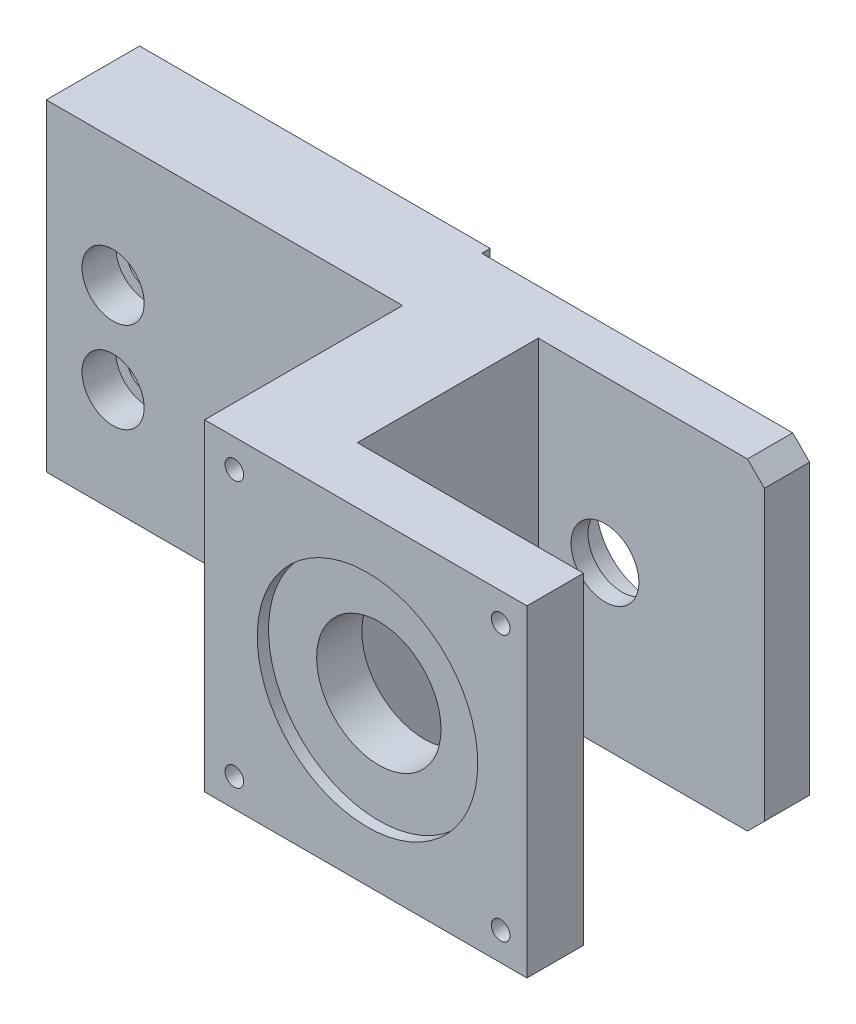
ISO-10303-21;
HEADER;
FILE_DESCRIPTION(('STEP AP214'),'2;1');
FILE_NAME('part.step','',(''),(''),'','','');
FILE_SCHEMA(('AUTOMOTIVE_DESIGN { 1 0 10303 214 1 1 1 1 }'));
ENDSEC;
DATA;
#1=APPLICATION_CONTEXT('core data for automotive mechanical design processes');
#2=APPLICATION_PROTOCOL_DEFINITION('international standard','automotive_design',2000,#1);
#3=PRODUCT_CONTEXT('',#1,'mechanical');
#4=PRODUCT('Part','Part','',(#3));
#5=PRODUCT_RELATED_PRODUCT_CATEGORY('part','',(#4));
#6=PRODUCT_DEFINITION_FORMATION('','',#4);
#7=PRODUCT_DEFINITION_CONTEXT('part definition',#1,'design');
#8=PRODUCT_DEFINITION('design','',#6,#7);
#9=PRODUCT_DEFINITION_SHAPE('','',#8);
#10=(LENGTH_UNIT() NAMED_UNIT(*) SI_UNIT(.MILLI.,.METRE.));
#11=(NAMED_UNIT(*) PLANE_ANGLE_UNIT() SI_UNIT($,.RADIAN.));
#12=(NAMED_UNIT(*) SI_UNIT($,.STERADIAN.) SOLID_ANGLE_UNIT());
#13=UNCERTAINTY_MEASURE_WITH_UNIT(LENGTH_MEASURE(1.E-05),#10,'distance_accuracy_value','');
#14=(GEOMETRIC_REPRESENTATION_CONTEXT(3) GLOBAL_UNCERTAINTY_ASSIGNED_CONTEXT((#13)) GLOBAL_UNIT_ASSIGNED_CONTEXT((#10,
#11,#12)) REPRESENTATION_CONTEXT('',''));
#15=CARTESIAN_POINT('',(0.,0.,0.));
#16=DIRECTION('',(0.,0.,1.));
#17=DIRECTION('',(1.,0.,0.));
#18=AXIS2_PLACEMENT_3D('',#15,#16,#17);
#19=CARTESIAN_POINT('',(91.8,28.5,50.));
#20=DIRECTION('',(0.,0.,-1.));
#21=DIRECTION('',(-1.,0.,0.));
#22=AXIS2_PLACEMENT_3D('',#19,#20,#21);
#23=CYLINDRICAL_SURFACE('',#22,11.);
#24=CARTESIAN_POINT('',(91.8,28.5,40.));
#25=DIRECTION('',(0.,0.,-1.));
#26=DIRECTION('',(-1.,0.,0.));
#27=AXIS2_PLACEMENT_3D('',#24,#25,#26);
#28=CIRCLE('',#27,11.);
#29=CARTESIAN_POINT('',(80.8,28.5,40.));
#30=VERTEX_POINT('',#29);
#31=EDGE_CURVE('E221',#30,#30,#28,.T.);
#32=ORIENTED_EDGE('',*,*,#31,.T.);
#33=EDGE_LOOP('',(#32));
#34=FACE_BOUND('',#33,.T.);
#35=CARTESIAN_POINT('',(91.8,28.5,48.));
#36=DIRECTION('',(0.,0.,1.));
#37=DIRECTION('',(1.,0.,0.));
#38=AXIS2_PLACEMENT_3D('',#35,#36,#37);
#39=CIRCLE('',#38,11.);
#40=CARTESIAN_POINT('',(102.8,28.5,48.));
#41=VERTEX_POINT('',#40);
#42=EDGE_CURVE('E217',#41,#41,#39,.F.);
#43=ORIENTED_EDGE('',*,*,#42,.F.);
#44=EDGE_LOOP('',(#43));
#45=FACE_BOUND('',#44,.T.);
#46=ADVANCED_FACE('F37',(#34,#45),#23,.F.);
#47=CARTESIAN_POINT('',(120.,0.,50.));
#48=DIRECTION('',(-1.,0.,0.));
#49=DIRECTION('',(0.,0.,1.));
#50=AXIS2_PLACEMENT_3D('',#47,#48,#49);
#51=PLANE('',#50);
#52=DIRECTION('',(0.,0.,-1.));
#53=VECTOR('',#52,1.);
#54=CARTESIAN_POINT('',(120.,0.,50.));
#55=LINE('',#54,#53);
#56=CARTESIAN_POINT('',(120.,0.,50.));
#57=VERTEX_POINT('',#56);
#58=CARTESIAN_POINT('',(120.,0.,40.));
#59=VERTEX_POINT('',#58);
#60=EDGE_CURVE('E291',#57,#59,#55,.T.);
#61=ORIENTED_EDGE('',*,*,#60,.T.);
#62=DIRECTION('',(0.,1.,0.));
#63=VECTOR('',#62,1.);
#64=CARTESIAN_POINT('',(120.,0.,40.));
#65=LINE('',#64,#63);
#66=CARTESIAN_POINT('',(120.,57.,40.));
#67=VERTEX_POINT('',#66);
#68=EDGE_CURVE('E320',#59,#67,#65,.T.);
#69=ORIENTED_EDGE('',*,*,#68,.T.);
#70=DIRECTION('',(0.,0.,-1.));
#71=VECTOR('',#70,1.);
#72=CARTESIAN_POINT('',(120.,57.,50.));
#73=LINE('',#72,#71);
#74=CARTESIAN_POINT('',(120.,57.,50.));
#75=VERTEX_POINT('',#74);
#76=EDGE_CURVE('E287',#75,#67,#73,.T.);
#77=ORIENTED_EDGE('',*,*,#76,.F.);
#78=DIRECTION('',(0.,1.,0.));
#79=VECTOR('',#78,1.);
#80=CARTESIAN_POINT('',(120.,0.,50.));
#81=LINE('',#80,#79);
#82=EDGE_CURVE('E455',#57,#75,#81,.T.);
#83=ORIENTED_EDGE('',*,*,#82,.F.);
#84=EDGE_LOOP('',(#61,#69,#77,#83));
#85=FACE_BOUND('',#84,.T.);
#86=ADVANCED_FACE('F360',(#85),#51,.F.);
#87=CARTESIAN_POINT('',(0.,0.,50.));
#88=DIRECTION('',(1.,0.,0.));
#89=DIRECTION('',(0.,0.,-1.));
#90=AXIS2_PLACEMENT_3D('',#87,#88,#89);
#91=PLANE('',#90);
#92=DIRECTION('',(0.,0.,-1.));
#93=VECTOR('',#92,1.);
#94=CARTESIAN_POINT('',(0.,0.,50.));
#95=LINE('',#94,#93);
#96=CARTESIAN_POINT('',(0.,0.,15.));
#97=VERTEX_POINT('',#96);
#98=CARTESIAN_POINT('',(0.,0.,-1.5));
#99=VERTEX_POINT('',#98);
#100=EDGE_CURVE('E272',#97,#99,#95,.T.);
#101=ORIENTED_EDGE('',*,*,#100,.F.);
#102=DIRECTION('',(0.,1.,0.));
#103=VECTOR('',#102,1.);
#104=CARTESIAN_POINT('',(0.,0.,15.));
#105=LINE('',#104,#103);
#106=CARTESIAN_POINT('',(0.,57.,15.));
#107=VERTEX_POINT('',#106);
#108=EDGE_CURVE('E310',#97,#107,#105,.T.);
#109=ORIENTED_EDGE('',*,*,#108,.T.);
#110=DIRECTION('',(0.,0.,-1.));
#111=VECTOR('',#110,1.);
#112=CARTESIAN_POINT('',(0.,57.,50.));
#113=LINE('',#112,#111);
#114=CARTESIAN_POINT('',(0.,57.,-1.5));
#115=VERTEX_POINT('',#114);
#116=EDGE_CURVE('E285',#107,#115,#113,.T.);
#117=ORIENTED_EDGE('',*,*,#116,.T.);
#118=DIRECTION('',(0.,1.,0.));
#119=VECTOR('',#118,1.);
#120=CARTESIAN_POINT('',(0.,57.,-1.5));
#121=LINE('',#120,#119);
#122=EDGE_CURVE('E237',#99,#115,#121,.T.);
#123=ORIENTED_EDGE('',*,*,#122,.F.);
#124=EDGE_LOOP('',(#101,#109,#117,#123));
#125=FACE_BOUND('',#124,.T.);
#126=ADVANCED_FACE('F307',(#125),#91,.F.);
#127=CARTESIAN_POINT('',(0.,0.,50.));
#128=DIRECTION('',(0.,1.,0.));
#129=DIRECTION('',(0.,0.,1.));
#130=AXIS2_PLACEMENT_3D('',#127,#128,#129);
#131=PLANE('',#130);
#132=DIRECTION('',(1.,0.,0.));
#133=VECTOR('',#132,1.);
#134=CARTESIAN_POINT('',(0.,0.,0.));
#135=LINE('',#134,#133);
#136=CARTESIAN_POINT('',(62.,0.,0.));
#137=VERTEX_POINT('',#136);
#138=CARTESIAN_POINT('',(117.,0.,0.));
#139=VERTEX_POINT('',#138);
#140=EDGE_CURVE('E256',#137,#139,#135,.T.);
#141=ORIENTED_EDGE('',*,*,#140,.T.);
#142=DIRECTION('',(0.,0.,1.));
#143=VECTOR('',#142,1.);
#144=CARTESIAN_POINT('',(117.,0.,50.));
#145=LINE('',#144,#143);
#146=CARTESIAN_POINT('',(117.,0.,8.));
#147=VERTEX_POINT('',#146);
#148=EDGE_CURVE('E62',#139,#147,#145,.T.);
#149=ORIENTED_EDGE('',*,*,#148,.T.);
#150=DIRECTION('',(-1.,0.,0.));
#151=VECTOR('',#150,1.);
#152=CARTESIAN_POINT('',(120.,0.,8.));
#153=LINE('',#152,#151);
#154=CARTESIAN_POINT('',(80.,0.,8.00000000000001));
#155=VERTEX_POINT('',#154);
#156=EDGE_CURVE('E477',#147,#155,#153,.T.);
#157=ORIENTED_EDGE('',*,*,#156,.T.);
#158=DIRECTION('',(0.,0.,1.));
#159=VECTOR('',#158,1.);
#160=CARTESIAN_POINT('',(80.,0.,8.00000000000001));
#161=LINE('',#160,#159);
#162=CARTESIAN_POINT('',(80.,0.,40.));
#163=VERTEX_POINT('',#162);
#164=EDGE_CURVE('E450',#155,#163,#161,.T.);
#165=ORIENTED_EDGE('',*,*,#164,.T.);
#166=DIRECTION('',(1.,0.,0.));
#167=VECTOR('',#166,1.);
#168=CARTESIAN_POINT('',(120.,0.,40.));
#169=LINE('',#168,#167);
#170=EDGE_CURVE('E444',#163,#59,#169,.T.);
#171=ORIENTED_EDGE('',*,*,#170,.T.);
#172=ORIENTED_EDGE('',*,*,#60,.F.);
#173=DIRECTION('',(1.,0.,0.));
#174=VECTOR('',#173,1.);
#175=CARTESIAN_POINT('',(0.,0.,50.));
#176=LINE('',#175,#174);
#177=CARTESIAN_POINT('',(63.,0.,50.));
#178=VERTEX_POINT('',#177);
#179=EDGE_CURVE('E279',#178,#57,#176,.T.);
#180=ORIENTED_EDGE('',*,*,#179,.F.);
#181=DIRECTION('',(0.,0.,-1.));
#182=VECTOR('',#181,1.);
#183=CARTESIAN_POINT('',(63.,0.,50.));
#184=LINE('',#183,#182);
#185=CARTESIAN_POINT('',(63.,0.,15.));
#186=VERTEX_POINT('',#185);
#187=EDGE_CURVE('E250',#178,#186,#184,.T.);
#188=ORIENTED_EDGE('',*,*,#187,.T.);
#189=DIRECTION('',(-1.,0.,0.));
#190=VECTOR('',#189,1.);
#191=CARTESIAN_POINT('',(0.,0.,15.));
#192=LINE('',#191,#190);
#193=EDGE_CURVE('E299',#186,#97,#192,.T.);
#194=ORIENTED_EDGE('',*,*,#193,.T.);
#195=ORIENTED_EDGE('',*,*,#100,.T.);
#196=DIRECTION('',(-1.,0.,0.));
#197=VECTOR('',#196,1.);
#198=CARTESIAN_POINT('',(0.,0.,-1.5));
#199=LINE('',#198,#197);
#200=CARTESIAN_POINT('',(62.,0.,-1.5));
#201=VERTEX_POINT('',#200);
#202=EDGE_CURVE('E244',#201,#99,#199,.T.);
#203=ORIENTED_EDGE('',*,*,#202,.F.);
#204=DIRECTION('',(0.,0.,1.));
#205=VECTOR('',#204,1.);
#206=CARTESIAN_POINT('',(62.,0.,-1.5));
#207=LINE('',#206,#205);
#208=EDGE_CURVE('E247',#201,#137,#207,.T.);
#209=ORIENTED_EDGE('',*,*,#208,.T.);
#210=EDGE_LOOP('',(#141,#149,#157,#165,#171,#172,#180,#188,#194,#195,#203,#209));
#211=FACE_BOUND('',#210,.T.);
#212=ADVANCED_FACE('F296',(#211),#131,.F.);
#213=DIRECTION('',(0.,1.,0.));
#214=VECTOR('',#213,1.);
#215=CARTESIAN_POINT('',(120.,0.,8.));
#216=LINE('',#215,#214);
#217=CARTESIAN_POINT('',(120.,3.00000000000001,8.));
#218=VERTEX_POINT('',#217);
#219=CARTESIAN_POINT('',(120.,54.,8.));
#220=VERTEX_POINT('',#219);
#221=EDGE_CURVE('E442',#218,#220,#216,.T.);
#222=ORIENTED_EDGE('',*,*,#221,.F.);
#223=DIRECTION('',(0.,0.,-1.));
#224=VECTOR('',#223,1.);
#225=CARTESIAN_POINT('',(120.,3.00000000000002,50.));
#226=LINE('',#225,#224);
#227=CARTESIAN_POINT('',(120.,3.00000000000004,0.));
#228=VERTEX_POINT('',#227);
#229=EDGE_CURVE('E271',#218,#228,#226,.T.);
#230=ORIENTED_EDGE('',*,*,#229,.T.);
#231=DIRECTION('',(0.,1.,0.));
#232=VECTOR('',#231,1.);
#233=CARTESIAN_POINT('',(120.,0.,0.));
#234=LINE('',#233,#232);
#235=CARTESIAN_POINT('',(120.,54.,0.));
#236=VERTEX_POINT('',#235);
#237=EDGE_CURVE('E280',#228,#236,#234,.T.);
#238=ORIENTED_EDGE('',*,*,#237,.T.);
#239=DIRECTION('',(0.,0.,1.));
#240=VECTOR('',#239,1.);
#241=CARTESIAN_POINT('',(120.,54.,50.));
#242=LINE('',#241,#240);
#243=EDGE_CURVE('E269',#236,#220,#242,.T.);
#244=ORIENTED_EDGE('',*,*,#243,.T.);
#245=EDGE_LOOP('',(#222,#230,#238,#244));
#246=FACE_BOUND('',#245,.T.);
#247=ADVANCED_FACE('F368',(#246),#51,.F.);
#248=CARTESIAN_POINT('',(0.,57.,50.));
#249=DIRECTION('',(0.,-1.,0.));
#250=DIRECTION('',(0.,0.,-1.));
#251=AXIS2_PLACEMENT_3D('',#248,#249,#250);
#252=PLANE('',#251);
#253=DIRECTION('',(-1.,0.,0.));
#254=VECTOR('',#253,1.);
#255=CARTESIAN_POINT('',(120.,57.,8.));
#256=LINE('',#255,#254);
#257=CARTESIAN_POINT('',(117.,57.,8.));
#258=VERTEX_POINT('',#257);
#259=CARTESIAN_POINT('',(80.,57.,8.00000000000001));
#260=VERTEX_POINT('',#259);
#261=EDGE_CURVE('E438',#258,#260,#256,.T.);
#262=ORIENTED_EDGE('',*,*,#261,.F.);
#263=DIRECTION('',(0.,0.,-1.));
#264=VECTOR('',#263,1.);
#265=CARTESIAN_POINT('',(117.,57.,50.));
#266=LINE('',#265,#264);
#267=CARTESIAN_POINT('',(117.,57.,0.));
#268=VERTEX_POINT('',#267);
#269=EDGE_CURVE('E11',#258,#268,#266,.T.);
#270=ORIENTED_EDGE('',*,*,#269,.T.);
#271=DIRECTION('',(-1.,0.,0.));
#272=VECTOR('',#271,1.);
#273=CARTESIAN_POINT('',(0.,57.,0.));
#274=LINE('',#273,#272);
#275=CARTESIAN_POINT('',(62.,57.,0.));
#276=VERTEX_POINT('',#275);
#277=EDGE_CURVE('E276',#268,#276,#274,.T.);
#278=ORIENTED_EDGE('',*,*,#277,.T.);
#279=DIRECTION('',(0.,0.,1.));
#280=VECTOR('',#279,1.);
#281=CARTESIAN_POINT('',(62.,57.,-1.5));
#282=LINE('',#281,#280);
#283=CARTESIAN_POINT('',(62.,57.,-1.5));
#284=VERTEX_POINT('',#283);
#285=EDGE_CURVE('E261',#284,#276,#282,.T.);
#286=ORIENTED_EDGE('',*,*,#285,.F.);
#287=DIRECTION('',(1.,0.,0.));
#288=VECTOR('',#287,1.);
#289=CARTESIAN_POINT('',(0.,57.,-1.5));
#290=LINE('',#289,#288);
#291=EDGE_CURVE('E240',#115,#284,#290,.T.);
#292=ORIENTED_EDGE('',*,*,#291,.F.);
#293=ORIENTED_EDGE('',*,*,#116,.F.);
#294=DIRECTION('',(-1.,0.,0.));
#295=VECTOR('',#294,1.);
#296=CARTESIAN_POINT('',(0.,57.,15.));
#297=LINE('',#296,#295);
#298=CARTESIAN_POINT('',(63.,57.,15.));
#299=VERTEX_POINT('',#298);
#300=EDGE_CURVE('E469',#299,#107,#297,.T.);
#301=ORIENTED_EDGE('',*,*,#300,.F.);
#302=DIRECTION('',(0.,0.,-1.));
#303=VECTOR('',#302,1.);
#304=CARTESIAN_POINT('',(63.,57.,50.));
#305=LINE('',#304,#303);
#306=CARTESIAN_POINT('',(63.,57.,50.));
#307=VERTEX_POINT('',#306);
#308=EDGE_CURVE('E266',#307,#299,#305,.T.);
#309=ORIENTED_EDGE('',*,*,#308,.F.);
#310=DIRECTION('',(-1.,0.,0.));
#311=VECTOR('',#310,1.);
#312=CARTESIAN_POINT('',(0.,57.,50.));
#313=LINE('',#312,#311);
#314=EDGE_CURVE('E288',#75,#307,#313,.T.);
#315=ORIENTED_EDGE('',*,*,#314,.F.);
#316=ORIENTED_EDGE('',*,*,#76,.T.);
#317=DIRECTION('',(1.,0.,0.));
#318=VECTOR('',#317,1.);
#319=CARTESIAN_POINT('',(120.,57.,40.));
#320=LINE('',#319,#318);
#321=CARTESIAN_POINT('',(80.,57.,40.));
#322=VERTEX_POINT('',#321);
#323=EDGE_CURVE('E479',#322,#67,#320,.T.);
#324=ORIENTED_EDGE('',*,*,#323,.F.);
#325=DIRECTION('',(0.,0.,1.));
#326=VECTOR('',#325,1.);
#327=CARTESIAN_POINT('',(80.,57.,8.00000000000001));
#328=LINE('',#327,#326);
#329=EDGE_CURVE('E483',#260,#322,#328,.T.);
#330=ORIENTED_EDGE('',*,*,#329,.F.);
#331=EDGE_LOOP('',(#262,#270,#278,#286,#292,#293,#301,#309,#315,#316,#324,#330));
#332=FACE_BOUND('',#331,.T.);
#333=ADVANCED_FACE('F314',(#332),#252,.F.);
#334=CARTESIAN_POINT('',(0.,57.,50.));
#335=DIRECTION('',(0.,0.,-1.));
#336=DIRECTION('',(-1.,0.,0.));
#337=AXIS2_PLACEMENT_3D('',#334,#335,#336);
#338=PLANE('',#337);
#339=CARTESIAN_POINT('',(68.25,52.,50.));
#340=DIRECTION('',(0.,0.,1.));
#341=DIRECTION('',(1.,0.,0.));
#342=AXIS2_PLACEMENT_3D('',#339,#340,#341);
#343=CIRCLE('',#342,1.65);
#344=CARTESIAN_POINT('',(69.9,52.,50.));
#345=VERTEX_POINT('',#344);
#346=EDGE_CURVE('E157',#345,#345,#343,.T.);
#347=ORIENTED_EDGE('',*,*,#346,.F.);
#348=EDGE_LOOP('',(#347));
#349=FACE_BOUND('',#348,.T.);
#350=CARTESIAN_POINT('',(115.35,5.00000000000001,50.));
#351=DIRECTION('',(0.,0.,1.));
#352=DIRECTION('',(1.,0.,0.));
#353=AXIS2_PLACEMENT_3D('',#350,#351,#352);
#354=CIRCLE('',#353,1.65);
#355=CARTESIAN_POINT('',(117.,5.00000000000001,50.));
#356=VERTEX_POINT('',#355);
#357=EDGE_CURVE('E156',#356,#356,#354,.T.);
#358=ORIENTED_EDGE('',*,*,#357,.F.);
#359=EDGE_LOOP('',(#358));
#360=FACE_BOUND('',#359,.T.);
#361=CARTESIAN_POINT('',(115.35,52.,50.));
#362=DIRECTION('',(0.,0.,1.));
#363=DIRECTION('',(1.,0.,0.));
#364=AXIS2_PLACEMENT_3D('',#361,#362,#363);
#365=CIRCLE('',#364,1.65);
#366=CARTESIAN_POINT('',(117.,52.,50.));
#367=VERTEX_POINT('',#366);
#368=EDGE_CURVE('E164',#367,#367,#365,.T.);
#369=ORIENTED_EDGE('',*,*,#368,.F.);
#370=EDGE_LOOP('',(#369));
#371=FACE_BOUND('',#370,.T.);
#372=CARTESIAN_POINT('',(68.25,5.,50.));
#373=DIRECTION('',(0.,0.,1.));
#374=DIRECTION('',(1.,0.,0.));
#375=AXIS2_PLACEMENT_3D('',#372,#373,#374);
#376=CIRCLE('',#375,1.65);
#377=CARTESIAN_POINT('',(69.9,5.,50.));
#378=VERTEX_POINT('',#377);
#379=EDGE_CURVE('E168',#378,#378,#376,.T.);
#380=ORIENTED_EDGE('',*,*,#379,.F.);
#381=EDGE_LOOP('',(#380));
#382=FACE_BOUND('',#381,.T.);
#383=CARTESIAN_POINT('',(91.8,28.5,50.));
#384=DIRECTION('',(0.,0.,1.));
#385=DIRECTION('',(1.,0.,0.));
#386=AXIS2_PLACEMENT_3D('',#383,#384,#385);
#387=CIRCLE('',#386,19.5);
#388=CARTESIAN_POINT('',(111.3,28.5,50.));
#389=VERTEX_POINT('',#388);
#390=EDGE_CURVE('E218',#389,#389,#387,.T.);
#391=ORIENTED_EDGE('',*,*,#390,.F.);
#392=EDGE_LOOP('',(#391));
#393=FACE_BOUND('',#392,.T.);
#394=ORIENTED_EDGE('',*,*,#314,.T.);
#395=DIRECTION('',(0.,1.,0.));
#396=VECTOR('',#395,1.);
#397=CARTESIAN_POINT('',(63.,0.,50.));
#398=LINE('',#397,#396);
#399=EDGE_CURVE('E462',#178,#307,#398,.T.);
#400=ORIENTED_EDGE('',*,*,#399,.F.);
#401=ORIENTED_EDGE('',*,*,#179,.T.);
#402=ORIENTED_EDGE('',*,*,#82,.T.);
#403=EDGE_LOOP('',(#394,#400,#401,#402));
#404=FACE_BOUND('',#403,.T.);
#405=ADVANCED_FACE('F411',(#349,#360,#371,#382,#393,#404),#338,.F.);
#406=CARTESIAN_POINT('',(0.,57.,0.));
#407=DIRECTION('',(0.,0.,-1.));
#408=DIRECTION('',(-1.,0.,0.));
#409=AXIS2_PLACEMENT_3D('',#406,#407,#408);
#410=PLANE('',#409);
#411=CARTESIAN_POINT('',(91.8,28.5,0.));
#412=DIRECTION('',(0.,0.,-1.));
#413=DIRECTION('',(-1.,0.,0.));
#414=AXIS2_PLACEMENT_3D('',#411,#412,#413);
#415=CIRCLE('',#414,9.49999999999999);
#416=CARTESIAN_POINT('',(82.3,28.5,0.));
#417=VERTEX_POINT('',#416);
#418=EDGE_CURVE('E230',#417,#417,#415,.T.);
#419=ORIENTED_EDGE('',*,*,#418,.F.);
#420=EDGE_LOOP('',(#419));
#421=FACE_BOUND('',#420,.T.);
#422=ORIENTED_EDGE('',*,*,#237,.F.);
#423=DIRECTION('',(0.707106781186551,0.707106781186544,0.));
#424=VECTOR('',#423,1.);
#425=CARTESIAN_POINT('',(86.9999999999994,-30.0000000000002,0.));
#426=LINE('',#425,#424);
#427=EDGE_CURVE('E325',#228,#139,#426,.F.);
#428=ORIENTED_EDGE('',*,*,#427,.T.);
#429=ORIENTED_EDGE('',*,*,#140,.F.);
#430=DIRECTION('',(0.,-1.,0.));
#431=VECTOR('',#430,1.);
#432=CARTESIAN_POINT('',(62.,57.,0.));
#433=LINE('',#432,#431);
#434=EDGE_CURVE('E234',#276,#137,#433,.T.);
#435=ORIENTED_EDGE('',*,*,#434,.F.);
#436=ORIENTED_EDGE('',*,*,#277,.F.);
#437=DIRECTION('',(-0.707106781186546,0.707106781186549,0.));
#438=VECTOR('',#437,1.);
#439=CARTESIAN_POINT('',(58.5000000000003,115.5,0.));
#440=LINE('',#439,#438);
#441=EDGE_CURVE('E275',#268,#236,#440,.F.);
#442=ORIENTED_EDGE('',*,*,#441,.T.);
#443=EDGE_LOOP('',(#422,#428,#429,#435,#436,#442));
#444=FACE_BOUND('',#443,.T.);
#445=ADVANCED_FACE('F403',(#421,#444),#410,.T.);
#446=CARTESIAN_POINT('',(120.,0.,40.));
#447=DIRECTION('',(0.,0.,1.));
#448=DIRECTION('',(1.,0.,0.));
#449=AXIS2_PLACEMENT_3D('',#446,#447,#448);
#450=PLANE('',#449);
#451=CARTESIAN_POINT('',(115.35,5.00000000000001,40.));
#452=DIRECTION('',(0.,0.,1.));
#453=DIRECTION('',(1.,0.,0.));
#454=AXIS2_PLACEMENT_3D('',#451,#452,#453);
#455=CIRCLE('',#454,1.65);
#456=CARTESIAN_POINT('',(117.,5.00000000000001,40.));
#457=VERTEX_POINT('',#456);
#458=EDGE_CURVE('E41',#457,#457,#455,.T.);
#459=ORIENTED_EDGE('',*,*,#458,.T.);
#460=EDGE_LOOP('',(#459));
#461=FACE_BOUND('',#460,.T.);
#462=CARTESIAN_POINT('',(115.35,52.,40.));
#463=DIRECTION('',(0.,0.,1.));
#464=DIRECTION('',(1.,0.,0.));
#465=AXIS2_PLACEMENT_3D('',#462,#463,#464);
#466=CIRCLE('',#465,1.65);
#467=CARTESIAN_POINT('',(117.,52.,40.));
#468=VERTEX_POINT('',#467);
#469=EDGE_CURVE('E167',#468,#468,#466,.T.);
#470=ORIENTED_EDGE('',*,*,#469,.T.);
#471=EDGE_LOOP('',(#470));
#472=FACE_BOUND('',#471,.T.);
#473=ORIENTED_EDGE('',*,*,#31,.F.);
#474=EDGE_LOOP('',(#473));
#475=FACE_BOUND('',#474,.T.);
#476=ORIENTED_EDGE('',*,*,#323,.T.);
#477=ORIENTED_EDGE('',*,*,#68,.F.);
#478=ORIENTED_EDGE('',*,*,#170,.F.);
#479=DIRECTION('',(0.,1.,0.));
#480=VECTOR('',#479,1.);
#481=CARTESIAN_POINT('',(80.,0.,40.));
#482=LINE('',#481,#480);
#483=EDGE_CURVE('E447',#163,#322,#482,.T.);
#484=ORIENTED_EDGE('',*,*,#483,.T.);
#485=EDGE_LOOP('',(#476,#477,#478,#484));
#486=FACE_BOUND('',#485,.T.);
#487=ADVANCED_FACE('F342',(#461,#472,#475,#486),#450,.F.);
#488=CARTESIAN_POINT('',(80.,0.,8.00000000000001));
#489=DIRECTION('',(-1.,0.,0.));
#490=DIRECTION('',(0.,0.,1.));
#491=AXIS2_PLACEMENT_3D('',#488,#489,#490);
#492=PLANE('',#491);
#493=ORIENTED_EDGE('',*,*,#329,.T.);
#494=ORIENTED_EDGE('',*,*,#483,.F.);
#495=ORIENTED_EDGE('',*,*,#164,.F.);
#496=DIRECTION('',(0.,1.,0.));
#497=VECTOR('',#496,1.);
#498=CARTESIAN_POINT('',(80.,0.,8.00000000000001));
#499=LINE('',#498,#497);
#500=EDGE_CURVE('E443',#155,#260,#499,.T.);
#501=ORIENTED_EDGE('',*,*,#500,.T.);
#502=EDGE_LOOP('',(#493,#494,#495,#501));
#503=FACE_BOUND('',#502,.T.);
#504=ADVANCED_FACE('F402',(#503),#492,.F.);
#505=CARTESIAN_POINT('',(120.,0.,8.));
#506=DIRECTION('',(0.,0.,-1.));
#507=DIRECTION('',(-1.,0.,0.));
#508=AXIS2_PLACEMENT_3D('',#505,#506,#507);
#509=PLANE('',#508);
#510=CARTESIAN_POINT('',(91.8,28.5,8.));
#511=DIRECTION('',(0.,0.,-1.));
#512=DIRECTION('',(-1.,0.,0.));
#513=AXIS2_PLACEMENT_3D('',#510,#511,#512);
#514=CIRCLE('',#513,6.);
#515=CARTESIAN_POINT('',(85.8,28.5,8.));
#516=VERTEX_POINT('',#515);
#517=EDGE_CURVE('E227',#516,#516,#514,.T.);
#518=ORIENTED_EDGE('',*,*,#517,.T.);
#519=EDGE_LOOP('',(#518));
#520=FACE_BOUND('',#519,.T.);
#521=ORIENTED_EDGE('',*,*,#156,.F.);
#522=DIRECTION('',(-0.707106781186551,-0.707106781186544,0.));
#523=VECTOR('',#522,1.);
#524=CARTESIAN_POINT('',(120.,3.00000000000001,8.));
#525=LINE('',#524,#523);
#526=EDGE_CURVE('E46',#147,#218,#525,.F.);
#527=ORIENTED_EDGE('',*,*,#526,.T.);
#528=ORIENTED_EDGE('',*,*,#221,.T.);
#529=DIRECTION('',(0.707106781186546,-0.707106781186549,0.));
#530=VECTOR('',#529,1.);
#531=CARTESIAN_POINT('',(117.,57.,8.));
#532=LINE('',#531,#530);
#533=EDGE_CURVE('E54',#220,#258,#532,.F.);
#534=ORIENTED_EDGE('',*,*,#533,.T.);
#535=ORIENTED_EDGE('',*,*,#261,.T.);
#536=ORIENTED_EDGE('',*,*,#500,.F.);
#537=EDGE_LOOP('',(#521,#527,#528,#534,#535,#536));
#538=FACE_BOUND('',#537,.T.);
#539=ADVANCED_FACE('F395',(#520,#538),#509,.F.);
#540=CARTESIAN_POINT('',(0.,0.,15.));
#541=DIRECTION('',(0.,0.,-1.));
#542=DIRECTION('',(-1.,0.,0.));
#543=AXIS2_PLACEMENT_3D('',#540,#541,#542);
#544=PLANE('',#543);
#545=CARTESIAN_POINT('',(11.8,34.4999999999999,15.));
#546=DIRECTION('',(0.,0.,1.));
#547=DIRECTION('',(1.,0.,0.));
#548=AXIS2_PLACEMENT_3D('',#545,#546,#547);
#549=CIRCLE('',#548,5.5);
#550=CARTESIAN_POINT('',(17.3,34.4999999999999,15.));
#551=VERTEX_POINT('',#550);
#552=EDGE_CURVE('E174',#551,#551,#549,.T.);
#553=ORIENTED_EDGE('',*,*,#552,.F.);
#554=EDGE_LOOP('',(#553));
#555=FACE_BOUND('',#554,.T.);
#556=CARTESIAN_POINT('',(11.8,18.4999999999999,15.));
#557=DIRECTION('',(0.,0.,1.));
#558=DIRECTION('',(1.,0.,0.));
#559=AXIS2_PLACEMENT_3D('',#556,#557,#558);
#560=CIRCLE('',#559,5.5);
#561=CARTESIAN_POINT('',(17.3,18.4999999999999,15.));
#562=VERTEX_POINT('',#561);
#563=EDGE_CURVE('E184',#562,#562,#560,.T.);
#564=ORIENTED_EDGE('',*,*,#563,.F.);
#565=EDGE_LOOP('',(#564));
#566=FACE_BOUND('',#565,.T.);
#567=CARTESIAN_POINT('',(51.8,18.4999999999999,15.));
#568=DIRECTION('',(0.,0.,1.));
#569=DIRECTION('',(1.,0.,0.));
#570=AXIS2_PLACEMENT_3D('',#567,#568,#569);
#571=CIRCLE('',#570,5.5);
#572=CARTESIAN_POINT('',(57.3,18.4999999999999,15.));
#573=VERTEX_POINT('',#572);
#574=EDGE_CURVE('E194',#573,#573,#571,.T.);
#575=ORIENTED_EDGE('',*,*,#574,.F.);
#576=EDGE_LOOP('',(#575));
#577=FACE_BOUND('',#576,.T.);
#578=CARTESIAN_POINT('',(51.8,34.4999999999999,15.));
#579=DIRECTION('',(0.,0.,1.));
#580=DIRECTION('',(1.,0.,0.));
#581=AXIS2_PLACEMENT_3D('',#578,#579,#580);
#582=CIRCLE('',#581,5.5);
#583=CARTESIAN_POINT('',(57.3,34.4999999999999,15.));
#584=VERTEX_POINT('',#583);
#585=EDGE_CURVE('E204',#584,#584,#582,.T.);
#586=ORIENTED_EDGE('',*,*,#585,.F.);
#587=EDGE_LOOP('',(#586));
#588=FACE_BOUND('',#587,.T.);
#589=ORIENTED_EDGE('',*,*,#300,.T.);
#590=ORIENTED_EDGE('',*,*,#108,.F.);
#591=ORIENTED_EDGE('',*,*,#193,.F.);
#592=DIRECTION('',(0.,1.,0.));
#593=VECTOR('',#592,1.);
#594=CARTESIAN_POINT('',(63.,0.,15.));
#595=LINE('',#594,#593);
#596=EDGE_CURVE('E474',#186,#299,#595,.T.);
#597=ORIENTED_EDGE('',*,*,#596,.T.);
#598=EDGE_LOOP('',(#589,#590,#591,#597));
#599=FACE_BOUND('',#598,.T.);
#600=ADVANCED_FACE('F392',(#555,#566,#577,#588,#599),#544,.F.);
#601=CARTESIAN_POINT('',(63.,0.,50.));
#602=DIRECTION('',(1.,0.,0.));
#603=DIRECTION('',(0.,0.,-1.));
#604=AXIS2_PLACEMENT_3D('',#601,#602,#603);
#605=PLANE('',#604);
#606=ORIENTED_EDGE('',*,*,#308,.T.);
#607=ORIENTED_EDGE('',*,*,#596,.F.);
#608=ORIENTED_EDGE('',*,*,#187,.F.);
#609=ORIENTED_EDGE('',*,*,#399,.T.);
#610=EDGE_LOOP('',(#606,#607,#608,#609));
#611=FACE_BOUND('',#610,.T.);
#612=ADVANCED_FACE('F391',(#611),#605,.F.);
#613=CARTESIAN_POINT('',(62.,57.,-1.5));
#614=DIRECTION('',(-1.,0.,0.));
#615=DIRECTION('',(0.,-1.,0.));
#616=AXIS2_PLACEMENT_3D('',#613,#614,#615);
#617=PLANE('',#616);
#618=ORIENTED_EDGE('',*,*,#434,.T.);
#619=ORIENTED_EDGE('',*,*,#208,.F.);
#620=DIRECTION('',(0.,-1.,0.));
#621=VECTOR('',#620,1.);
#622=CARTESIAN_POINT('',(62.,57.,-1.5));
#623=LINE('',#622,#621);
#624=EDGE_CURVE('E242',#284,#201,#623,.T.);
#625=ORIENTED_EDGE('',*,*,#624,.F.);
#626=ORIENTED_EDGE('',*,*,#285,.T.);
#627=EDGE_LOOP('',(#618,#619,#625,#626));
#628=FACE_BOUND('',#627,.T.);
#629=ADVANCED_FACE('F318',(#628),#617,.F.);
#630=CARTESIAN_POINT('',(0.,0.,-1.5));
#631=DIRECTION('',(0.,0.,1.));
#632=DIRECTION('',(1.,0.,0.));
#633=AXIS2_PLACEMENT_3D('',#630,#631,#632);
#634=PLANE('',#633);
#635=CARTESIAN_POINT('',(11.8,34.4999999999999,-1.5));
#636=DIRECTION('',(0.,0.,1.));
#637=DIRECTION('',(1.,0.,0.));
#638=AXIS2_PLACEMENT_3D('',#635,#636,#637);
#639=CIRCLE('',#638,3.5);
#640=CARTESIAN_POINT('',(15.3,34.4999999999999,-1.5));
#641=VERTEX_POINT('',#640);
#642=EDGE_CURVE('E183',#641,#641,#639,.T.);
#643=ORIENTED_EDGE('',*,*,#642,.T.);
#644=EDGE_LOOP('',(#643));
#645=FACE_BOUND('',#644,.T.);
#646=CARTESIAN_POINT('',(11.8,18.4999999999999,-1.5));
#647=DIRECTION('',(0.,0.,1.));
#648=DIRECTION('',(1.,0.,0.));
#649=AXIS2_PLACEMENT_3D('',#646,#647,#648);
#650=CIRCLE('',#649,3.5);
#651=CARTESIAN_POINT('',(15.3,18.4999999999999,-1.5));
#652=VERTEX_POINT('',#651);
#653=EDGE_CURVE('E193',#652,#652,#650,.T.);
#654=ORIENTED_EDGE('',*,*,#653,.T.);
#655=EDGE_LOOP('',(#654));
#656=FACE_BOUND('',#655,.T.);
#657=CARTESIAN_POINT('',(51.8,18.4999999999999,-1.5));
#658=DIRECTION('',(0.,0.,1.));
#659=DIRECTION('',(1.,0.,0.));
#660=AXIS2_PLACEMENT_3D('',#657,#658,#659);
#661=CIRCLE('',#660,3.5);
#662=CARTESIAN_POINT('',(55.3,18.4999999999999,-1.5));
#663=VERTEX_POINT('',#662);
#664=EDGE_CURVE('E203',#663,#663,#661,.T.);
#665=ORIENTED_EDGE('',*,*,#664,.T.);
#666=EDGE_LOOP('',(#665));
#667=FACE_BOUND('',#666,.T.);
#668=CARTESIAN_POINT('',(51.8,34.4999999999999,-1.5));
#669=DIRECTION('',(0.,0.,1.));
#670=DIRECTION('',(1.,0.,0.));
#671=AXIS2_PLACEMENT_3D('',#668,#669,#670);
#672=CIRCLE('',#671,3.5);
#673=CARTESIAN_POINT('',(55.3,34.4999999999999,-1.5));
#674=VERTEX_POINT('',#673);
#675=EDGE_CURVE('E213',#674,#674,#672,.T.);
#676=ORIENTED_EDGE('',*,*,#675,.T.);
#677=EDGE_LOOP('',(#676));
#678=FACE_BOUND('',#677,.T.);
#679=ORIENTED_EDGE('',*,*,#122,.T.);
#680=ORIENTED_EDGE('',*,*,#291,.T.);
#681=ORIENTED_EDGE('',*,*,#624,.T.);
#682=ORIENTED_EDGE('',*,*,#202,.T.);
#683=EDGE_LOOP('',(#679,#680,#681,#682));
#684=FACE_BOUND('',#683,.T.);
#685=ADVANCED_FACE('F304',(#645,#656,#667,#678,#684),#634,.F.);
#686=CARTESIAN_POINT('',(91.8,28.5,5.));
#687=DIRECTION('',(0.,0.,-1.));
#688=DIRECTION('',(-1.,0.,0.));
#689=AXIS2_PLACEMENT_3D('',#686,#687,#688);
#690=CYLINDRICAL_SURFACE('',#689,9.49999999999999);
#691=CARTESIAN_POINT('',(91.8,28.5,5.));
#692=DIRECTION('',(0.,0.,-1.));
#693=DIRECTION('',(-1.,0.,0.));
#694=AXIS2_PLACEMENT_3D('',#691,#692,#693);
#695=CIRCLE('',#694,9.49999999999999);
#696=CARTESIAN_POINT('',(82.3,28.5,5.));
#697=VERTEX_POINT('',#696);
#698=EDGE_CURVE('E231',#697,#697,#695,.T.);
#699=ORIENTED_EDGE('',*,*,#698,.F.);
#700=EDGE_LOOP('',(#699));
#701=FACE_BOUND('',#700,.T.);
#702=ORIENTED_EDGE('',*,*,#418,.T.);
#703=EDGE_LOOP('',(#702));
#704=FACE_BOUND('',#703,.T.);
#705=ADVANCED_FACE('F381',(#701,#704),#690,.F.);
#706=CARTESIAN_POINT('',(91.8,28.5,5.));
#707=DIRECTION('',(0.,0.,-1.));
#708=DIRECTION('',(-1.,0.,0.));
#709=AXIS2_PLACEMENT_3D('',#706,#707,#708);
#710=PLANE('',#709);
#711=CARTESIAN_POINT('',(91.8,28.5,5.));
#712=DIRECTION('',(0.,0.,-1.));
#713=DIRECTION('',(-1.,0.,0.));
#714=AXIS2_PLACEMENT_3D('',#711,#712,#713);
#715=CIRCLE('',#714,6.);
#716=CARTESIAN_POINT('',(85.8,28.5,5.));
#717=VERTEX_POINT('',#716);
#718=EDGE_CURVE('E224',#717,#717,#715,.T.);
#719=ORIENTED_EDGE('',*,*,#718,.F.);
#720=EDGE_LOOP('',(#719));
#721=FACE_BOUND('',#720,.T.);
#722=ORIENTED_EDGE('',*,*,#698,.T.);
#723=EDGE_LOOP('',(#722));
#724=FACE_BOUND('',#723,.T.);
#725=ADVANCED_FACE('F377',(#721,#724),#710,.T.);
#726=CARTESIAN_POINT('',(91.8,28.5,25.));
#727=DIRECTION('',(0.,0.,-1.));
#728=DIRECTION('',(-1.,0.,0.));
#729=AXIS2_PLACEMENT_3D('',#726,#727,#728);
#730=CYLINDRICAL_SURFACE('',#729,6.);
#731=ORIENTED_EDGE('',*,*,#718,.T.);
#732=EDGE_LOOP('',(#731));
#733=FACE_BOUND('',#732,.T.);
#734=ORIENTED_EDGE('',*,*,#517,.F.);
#735=EDGE_LOOP('',(#734));
#736=FACE_BOUND('',#735,.T.);
#737=ADVANCED_FACE('F374',(#733,#736),#730,.F.);
#738=CARTESIAN_POINT('',(120.,3.00000000000002,50.));
#739=DIRECTION('',(-0.707106781186544,0.707106781186551,0.));
#740=DIRECTION('',(-0.707106781186551,-0.707106781186544,0.));
#741=AXIS2_PLACEMENT_3D('',#738,#739,#740);
#742=PLANE('',#741);
#743=ORIENTED_EDGE('',*,*,#526,.F.);
#744=ORIENTED_EDGE('',*,*,#148,.F.);
#745=ORIENTED_EDGE('',*,*,#427,.F.);
#746=ORIENTED_EDGE('',*,*,#229,.F.);
#747=EDGE_LOOP('',(#743,#744,#745,#746));
#748=FACE_BOUND('',#747,.T.);
#749=ADVANCED_FACE('F323',(#748),#742,.F.);
#750=CARTESIAN_POINT('',(117.,57.,50.));
#751=DIRECTION('',(-0.707106781186549,-0.707106781186546,0.));
#752=DIRECTION('',(0.707106781186546,-0.707106781186549,0.));
#753=AXIS2_PLACEMENT_3D('',#750,#751,#752);
#754=PLANE('',#753);
#755=ORIENTED_EDGE('',*,*,#533,.F.);
#756=ORIENTED_EDGE('',*,*,#243,.F.);
#757=ORIENTED_EDGE('',*,*,#441,.F.);
#758=ORIENTED_EDGE('',*,*,#269,.F.);
#759=EDGE_LOOP('',(#755,#756,#757,#758));
#760=FACE_BOUND('',#759,.T.);
#761=ADVANCED_FACE('F39',(#760),#754,.F.);
#762=CARTESIAN_POINT('',(91.8,28.5,48.));
#763=DIRECTION('',(0.,0.,1.));
#764=DIRECTION('',(1.,0.,0.));
#765=AXIS2_PLACEMENT_3D('',#762,#763,#764);
#766=PLANE('',#765);
#767=CARTESIAN_POINT('',(91.8,28.5,48.));
#768=DIRECTION('',(0.,0.,1.));
#769=DIRECTION('',(1.,0.,0.));
#770=AXIS2_PLACEMENT_3D('',#767,#768,#769);
#771=CIRCLE('',#770,19.5);
#772=CARTESIAN_POINT('',(111.3,28.5,48.));
#773=VERTEX_POINT('',#772);
#774=EDGE_CURVE('E214',#773,#773,#771,.T.);
#775=ORIENTED_EDGE('',*,*,#774,.T.);
#776=EDGE_LOOP('',(#775));
#777=FACE_BOUND('',#776,.T.);
#778=ORIENTED_EDGE('',*,*,#42,.T.);
#779=EDGE_LOOP('',(#778));
#780=FACE_BOUND('',#779,.T.);
#781=ADVANCED_FACE('F429',(#777,#780),#766,.T.);
#782=CARTESIAN_POINT('',(91.8,28.5,48.));
#783=DIRECTION('',(0.,0.,1.));
#784=DIRECTION('',(1.,0.,0.));
#785=AXIS2_PLACEMENT_3D('',#782,#783,#784);
#786=CYLINDRICAL_SURFACE('',#785,19.5);
#787=ORIENTED_EDGE('',*,*,#774,.F.);
#788=EDGE_LOOP('',(#787));
#789=FACE_BOUND('',#788,.T.);
#790=ORIENTED_EDGE('',*,*,#390,.T.);
#791=EDGE_LOOP('',(#790));
#792=FACE_BOUND('',#791,.T.);
#793=ADVANCED_FACE('F372',(#789,#792),#786,.F.);
#794=CARTESIAN_POINT('',(51.8,34.4999999999999,15.));
#795=DIRECTION('',(0.,0.,1.));
#796=DIRECTION('',(1.,0.,0.));
#797=AXIS2_PLACEMENT_3D('',#794,#795,#796);
#798=CYLINDRICAL_SURFACE('',#797,3.5);
#799=CARTESIAN_POINT('',(51.8,34.4999999999999,9.));
#800=DIRECTION('',(0.,0.,1.));
#801=DIRECTION('',(1.,0.,0.));
#802=AXIS2_PLACEMENT_3D('',#799,#800,#801);
#803=CIRCLE('',#802,3.5);
#804=CARTESIAN_POINT('',(55.3,34.4999999999999,9.));
#805=VERTEX_POINT('',#804);
#806=EDGE_CURVE('E210',#805,#805,#803,.T.);
#807=ORIENTED_EDGE('',*,*,#806,.T.);
#808=EDGE_LOOP('',(#807));
#809=FACE_BOUND('',#808,.T.);
#810=ORIENTED_EDGE('',*,*,#675,.F.);
#811=EDGE_LOOP('',(#810));
#812=FACE_BOUND('',#811,.T.);
#813=ADVANCED_FACE('F497',(#809,#812),#798,.F.);
#814=CARTESIAN_POINT('',(55.3,34.4999999999999,9.));
#815=DIRECTION('',(0.,0.,-1.));
#816=DIRECTION('',(-1.,0.,0.));
#817=AXIS2_PLACEMENT_3D('',#814,#815,#816);
#818=PLANE('',#817);
#819=ORIENTED_EDGE('',*,*,#806,.F.);
#820=EDGE_LOOP('',(#819));
#821=FACE_BOUND('',#820,.T.);
#822=CARTESIAN_POINT('',(51.8,34.4999999999999,9.));
#823=DIRECTION('',(0.,0.,1.));
#824=DIRECTION('',(1.,0.,0.));
#825=AXIS2_PLACEMENT_3D('',#822,#823,#824);
#826=CIRCLE('',#825,5.5);
#827=CARTESIAN_POINT('',(57.3,34.4999999999999,9.));
#828=VERTEX_POINT('',#827);
#829=EDGE_CURVE('E207',#828,#828,#826,.T.);
#830=ORIENTED_EDGE('',*,*,#829,.T.);
#831=EDGE_LOOP('',(#830));
#832=FACE_BOUND('',#831,.T.);
#833=ADVANCED_FACE('F503',(#821,#832),#818,.F.);
#834=CARTESIAN_POINT('',(51.8,34.4999999999999,15.));
#835=DIRECTION('',(0.,0.,1.));
#836=DIRECTION('',(1.,0.,0.));
#837=AXIS2_PLACEMENT_3D('',#834,#835,#836);
#838=CYLINDRICAL_SURFACE('',#837,5.5);
#839=ORIENTED_EDGE('',*,*,#829,.F.);
#840=EDGE_LOOP('',(#839));
#841=FACE_BOUND('',#840,.T.);
#842=ORIENTED_EDGE('',*,*,#585,.T.);
#843=EDGE_LOOP('',(#842));
#844=FACE_BOUND('',#843,.T.);
#845=ADVANCED_FACE('F507',(#841,#844),#838,.F.);
#846=CARTESIAN_POINT('',(51.8,18.4999999999999,15.));
#847=DIRECTION('',(0.,0.,1.));
#848=DIRECTION('',(1.,0.,0.));
#849=AXIS2_PLACEMENT_3D('',#846,#847,#848);
#850=CYLINDRICAL_SURFACE('',#849,3.5);
#851=CARTESIAN_POINT('',(51.8,18.4999999999999,9.));
#852=DIRECTION('',(0.,0.,1.));
#853=DIRECTION('',(1.,0.,0.));
#854=AXIS2_PLACEMENT_3D('',#851,#852,#853);
#855=CIRCLE('',#854,3.5);
#856=CARTESIAN_POINT('',(55.3,18.4999999999999,9.));
#857=VERTEX_POINT('',#856);
#858=EDGE_CURVE('E200',#857,#857,#855,.T.);
#859=ORIENTED_EDGE('',*,*,#858,.T.);
#860=EDGE_LOOP('',(#859));
#861=FACE_BOUND('',#860,.T.);
#862=ORIENTED_EDGE('',*,*,#664,.F.);
#863=EDGE_LOOP('',(#862));
#864=FACE_BOUND('',#863,.T.);
#865=ADVANCED_FACE('F511',(#861,#864),#850,.F.);
#866=CARTESIAN_POINT('',(55.3,18.4999999999999,9.));
#867=DIRECTION('',(0.,0.,-1.));
#868=DIRECTION('',(-1.,0.,0.));
#869=AXIS2_PLACEMENT_3D('',#866,#867,#868);
#870=PLANE('',#869);
#871=ORIENTED_EDGE('',*,*,#858,.F.);
#872=EDGE_LOOP('',(#871));
#873=FACE_BOUND('',#872,.T.);
#874=CARTESIAN_POINT('',(51.8,18.4999999999999,9.));
#875=DIRECTION('',(0.,0.,1.));
#876=DIRECTION('',(1.,0.,0.));
#877=AXIS2_PLACEMENT_3D('',#874,#875,#876);
#878=CIRCLE('',#877,5.5);
#879=CARTESIAN_POINT('',(57.3,18.4999999999999,9.));
#880=VERTEX_POINT('',#879);
#881=EDGE_CURVE('E197',#880,#880,#878,.T.);
#882=ORIENTED_EDGE('',*,*,#881,.T.);
#883=EDGE_LOOP('',(#882));
#884=FACE_BOUND('',#883,.T.);
#885=ADVANCED_FACE('F515',(#873,#884),#870,.F.);
#886=CARTESIAN_POINT('',(51.8,18.4999999999999,15.));
#887=DIRECTION('',(0.,0.,1.));
#888=DIRECTION('',(1.,0.,0.));
#889=AXIS2_PLACEMENT_3D('',#886,#887,#888);
#890=CYLINDRICAL_SURFACE('',#889,5.5);
#891=ORIENTED_EDGE('',*,*,#881,.F.);
#892=EDGE_LOOP('',(#891));
#893=FACE_BOUND('',#892,.T.);
#894=ORIENTED_EDGE('',*,*,#574,.T.);
#895=EDGE_LOOP('',(#894));
#896=FACE_BOUND('',#895,.T.);
#897=ADVANCED_FACE('F519',(#893,#896),#890,.F.);
#898=CARTESIAN_POINT('',(11.8,18.4999999999999,15.));
#899=DIRECTION('',(0.,0.,1.));
#900=DIRECTION('',(1.,0.,0.));
#901=AXIS2_PLACEMENT_3D('',#898,#899,#900);
#902=CYLINDRICAL_SURFACE('',#901,3.5);
#903=CARTESIAN_POINT('',(11.8,18.4999999999999,9.));
#904=DIRECTION('',(0.,0.,1.));
#905=DIRECTION('',(1.,0.,0.));
#906=AXIS2_PLACEMENT_3D('',#903,#904,#905);
#907=CIRCLE('',#906,3.5);
#908=CARTESIAN_POINT('',(15.3,18.4999999999999,9.));
#909=VERTEX_POINT('',#908);
#910=EDGE_CURVE('E190',#909,#909,#907,.T.);
#911=ORIENTED_EDGE('',*,*,#910,.T.);
#912=EDGE_LOOP('',(#911));
#913=FACE_BOUND('',#912,.T.);
#914=ORIENTED_EDGE('',*,*,#653,.F.);
#915=EDGE_LOOP('',(#914));
#916=FACE_BOUND('',#915,.T.);
#917=ADVANCED_FACE('F523',(#913,#916),#902,.F.);
#918=CARTESIAN_POINT('',(15.3,18.4999999999999,9.));
#919=DIRECTION('',(0.,0.,-1.));
#920=DIRECTION('',(-1.,0.,0.));
#921=AXIS2_PLACEMENT_3D('',#918,#919,#920);
#922=PLANE('',#921);
#923=ORIENTED_EDGE('',*,*,#910,.F.);
#924=EDGE_LOOP('',(#923));
#925=FACE_BOUND('',#924,.T.);
#926=CARTESIAN_POINT('',(11.8,18.4999999999999,9.));
#927=DIRECTION('',(0.,0.,1.));
#928=DIRECTION('',(1.,0.,0.));
#929=AXIS2_PLACEMENT_3D('',#926,#927,#928);
#930=CIRCLE('',#929,5.5);
#931=CARTESIAN_POINT('',(17.3,18.4999999999999,9.));
#932=VERTEX_POINT('',#931);
#933=EDGE_CURVE('E187',#932,#932,#930,.T.);
#934=ORIENTED_EDGE('',*,*,#933,.T.);
#935=EDGE_LOOP('',(#934));
#936=FACE_BOUND('',#935,.T.);
#937=ADVANCED_FACE('F527',(#925,#936),#922,.F.);
#938=CARTESIAN_POINT('',(11.8,18.4999999999999,15.));
#939=DIRECTION('',(0.,0.,1.));
#940=DIRECTION('',(1.,0.,0.));
#941=AXIS2_PLACEMENT_3D('',#938,#939,#940);
#942=CYLINDRICAL_SURFACE('',#941,5.5);
#943=ORIENTED_EDGE('',*,*,#933,.F.);
#944=EDGE_LOOP('',(#943));
#945=FACE_BOUND('',#944,.T.);
#946=ORIENTED_EDGE('',*,*,#563,.T.);
#947=EDGE_LOOP('',(#946));
#948=FACE_BOUND('',#947,.T.);
#949=ADVANCED_FACE('F531',(#945,#948),#942,.F.);
#950=CARTESIAN_POINT('',(11.8,34.4999999999999,15.));
#951=DIRECTION('',(0.,0.,1.));
#952=DIRECTION('',(1.,0.,0.));
#953=AXIS2_PLACEMENT_3D('',#950,#951,#952);
#954=CYLINDRICAL_SURFACE('',#953,3.5);
#955=CARTESIAN_POINT('',(11.8,34.4999999999999,9.));
#956=DIRECTION('',(0.,0.,1.));
#957=DIRECTION('',(1.,0.,0.));
#958=AXIS2_PLACEMENT_3D('',#955,#956,#957);
#959=CIRCLE('',#958,3.5);
#960=CARTESIAN_POINT('',(15.3,34.4999999999999,9.));
#961=VERTEX_POINT('',#960);
#962=EDGE_CURVE('E180',#961,#961,#959,.T.);
#963=ORIENTED_EDGE('',*,*,#962,.T.);
#964=EDGE_LOOP('',(#963));
#965=FACE_BOUND('',#964,.T.);
#966=ORIENTED_EDGE('',*,*,#642,.F.);
#967=EDGE_LOOP('',(#966));
#968=FACE_BOUND('',#967,.T.);
#969=ADVANCED_FACE('F535',(#965,#968),#954,.F.);
#970=CARTESIAN_POINT('',(15.3,34.4999999999999,9.));
#971=DIRECTION('',(0.,0.,-1.));
#972=DIRECTION('',(-1.,0.,0.));
#973=AXIS2_PLACEMENT_3D('',#970,#971,#972);
#974=PLANE('',#973);
#975=ORIENTED_EDGE('',*,*,#962,.F.);
#976=EDGE_LOOP('',(#975));
#977=FACE_BOUND('',#976,.T.);
#978=CARTESIAN_POINT('',(11.8,34.4999999999999,9.));
#979=DIRECTION('',(0.,0.,1.));
#980=DIRECTION('',(1.,0.,0.));
#981=AXIS2_PLACEMENT_3D('',#978,#979,#980);
#982=CIRCLE('',#981,5.5);
#983=CARTESIAN_POINT('',(17.3,34.4999999999999,9.));
#984=VERTEX_POINT('',#983);
#985=EDGE_CURVE('E177',#984,#984,#982,.T.);
#986=ORIENTED_EDGE('',*,*,#985,.T.);
#987=EDGE_LOOP('',(#986));
#988=FACE_BOUND('',#987,.T.);
#989=ADVANCED_FACE('F539',(#977,#988),#974,.F.);
#990=CARTESIAN_POINT('',(11.8,34.4999999999999,15.));
#991=DIRECTION('',(0.,0.,1.));
#992=DIRECTION('',(1.,0.,0.));
#993=AXIS2_PLACEMENT_3D('',#990,#991,#992);
#994=CYLINDRICAL_SURFACE('',#993,5.5);
#995=ORIENTED_EDGE('',*,*,#985,.F.);
#996=EDGE_LOOP('',(#995));
#997=FACE_BOUND('',#996,.T.);
#998=ORIENTED_EDGE('',*,*,#552,.T.);
#999=EDGE_LOOP('',(#998));
#1000=FACE_BOUND('',#999,.T.);
#1001=ADVANCED_FACE('F543',(#997,#1000),#994,.F.);
#1002=CARTESIAN_POINT('',(68.25,5.,39.9));
#1003=DIRECTION('',(0.,0.,1.));
#1004=DIRECTION('',(1.,0.,0.));
#1005=AXIS2_PLACEMENT_3D('',#1002,#1003,#1004);
#1006=CONICAL_SURFACE('',#1005,1.65,1.02974425867665);
#1007=CARTESIAN_POINT('',(68.25,5.,38.9085799786045));
#1008=VERTEX_POINT('',#1007);
#1009=VERTEX_LOOP('',#1008);
#1010=FACE_BOUND('',#1009,.T.);
#1011=CARTESIAN_POINT('',(68.25,5.,39.9));
#1012=DIRECTION('',(0.,0.,1.));
#1013=DIRECTION('',(1.,0.,0.));
#1014=AXIS2_PLACEMENT_3D('',#1011,#1012,#1013);
#1015=CIRCLE('',#1014,1.65);
#1016=CARTESIAN_POINT('',(69.9,5.,39.9));
#1017=VERTEX_POINT('',#1016);
#1018=EDGE_CURVE('E171',#1017,#1017,#1015,.T.);
#1019=ORIENTED_EDGE('',*,*,#1018,.T.);
#1020=EDGE_LOOP('',(#1019));
#1021=FACE_BOUND('',#1020,.T.);
#1022=ADVANCED_FACE('F356',(#1010,#1021),#1006,.F.);
#1023=CARTESIAN_POINT('',(68.25,5.,50.));
#1024=DIRECTION('',(0.,0.,1.));
#1025=DIRECTION('',(1.,0.,0.));
#1026=AXIS2_PLACEMENT_3D('',#1023,#1024,#1025);
#1027=CYLINDRICAL_SURFACE('',#1026,1.65);
#1028=ORIENTED_EDGE('',*,*,#1018,.F.);
#1029=EDGE_LOOP('',(#1028));
#1030=FACE_BOUND('',#1029,.T.);
#1031=ORIENTED_EDGE('',*,*,#379,.T.);
#1032=EDGE_LOOP('',(#1031));
#1033=FACE_BOUND('',#1032,.T.);
#1034=ADVANCED_FACE('F347',(#1030,#1033),#1027,.F.);
#1035=CARTESIAN_POINT('',(115.35,52.,50.));
#1036=DIRECTION('',(0.,0.,1.));
#1037=DIRECTION('',(1.,0.,0.));
#1038=AXIS2_PLACEMENT_3D('',#1035,#1036,#1037);
#1039=CYLINDRICAL_SURFACE('',#1038,1.65);
#1040=ORIENTED_EDGE('',*,*,#368,.T.);
#1041=EDGE_LOOP('',(#1040));
#1042=FACE_BOUND('',#1041,.T.);
#1043=ORIENTED_EDGE('',*,*,#469,.F.);
#1044=EDGE_LOOP('',(#1043));
#1045=FACE_BOUND('',#1044,.T.);
#1046=ADVANCED_FACE('F345',(#1042,#1045),#1039,.F.);
#1047=CARTESIAN_POINT('',(115.35,5.00000000000001,50.));
#1048=DIRECTION('',(0.,0.,1.));
#1049=DIRECTION('',(1.,0.,0.));
#1050=AXIS2_PLACEMENT_3D('',#1047,#1048,#1049);
#1051=CYLINDRICAL_SURFACE('',#1050,1.65);
#1052=ORIENTED_EDGE('',*,*,#357,.T.);
#1053=EDGE_LOOP('',(#1052));
#1054=FACE_BOUND('',#1053,.T.);
#1055=ORIENTED_EDGE('',*,*,#458,.F.);
#1056=EDGE_LOOP('',(#1055));
#1057=FACE_BOUND('',#1056,.T.);
#1058=ADVANCED_FACE('F150',(#1054,#1057),#1051,.F.);
#1059=CARTESIAN_POINT('',(68.25,52.,39.9));
#1060=DIRECTION('',(0.,0.,1.));
#1061=DIRECTION('',(1.,0.,0.));
#1062=AXIS2_PLACEMENT_3D('',#1059,#1060,#1061);
#1063=CONICAL_SURFACE('',#1062,1.65,1.02974425867665);
#1064=CARTESIAN_POINT('',(68.25,52.,38.9085799786045));
#1065=VERTEX_POINT('',#1064);
#1066=VERTEX_LOOP('',#1065);
#1067=FACE_BOUND('',#1066,.T.);
#1068=CARTESIAN_POINT('',(68.25,52.,39.9));
#1069=DIRECTION('',(0.,0.,1.));
#1070=DIRECTION('',(1.,0.,0.));
#1071=AXIS2_PLACEMENT_3D('',#1068,#1069,#1070);
#1072=CIRCLE('',#1071,1.65);
#1073=CARTESIAN_POINT('',(69.9,52.,39.9));
#1074=VERTEX_POINT('',#1073);
#1075=EDGE_CURVE('E154',#1074,#1074,#1072,.T.);
#1076=ORIENTED_EDGE('',*,*,#1075,.T.);
#1077=EDGE_LOOP('',(#1076));
#1078=FACE_BOUND('',#1077,.T.);
#1079=ADVANCED_FACE('F146',(#1067,#1078),#1063,.F.);
#1080=CARTESIAN_POINT('',(68.25,52.,50.));
#1081=DIRECTION('',(0.,0.,1.));
#1082=DIRECTION('',(1.,0.,0.));
#1083=AXIS2_PLACEMENT_3D('',#1080,#1081,#1082);
#1084=CYLINDRICAL_SURFACE('',#1083,1.65);
#1085=ORIENTED_EDGE('',*,*,#1075,.F.);
#1086=EDGE_LOOP('',(#1085));
#1087=FACE_BOUND('',#1086,.T.);
#1088=ORIENTED_EDGE('',*,*,#346,.T.);
#1089=EDGE_LOOP('',(#1088));
#1090=FACE_BOUND('',#1089,.T.);
#1091=ADVANCED_FACE('F149',(#1087,#1090),#1084,.F.);
#1092=CLOSED_SHELL('',(#46,#86,#126,#212,#247,#333,#405,#445,#487,#504,#539,#600,#612,#629,#685,
#705,#725,#737,#749,#761,#781,#793,#813,#833,#845,#865,#885,#897,#917,#937,#949,#969,#989,#1001,
#1022,#1034,#1046,#1058,#1079,#1091));
#1093=MANIFOLD_SOLID_BREP('B2',#1092);
#1094=ADVANCED_BREP_SHAPE_REPRESENTATION('',(#18,#1093),#14);
#1095=SHAPE_DEFINITION_REPRESENTATION(#9,#1094);
ENDSEC;
END-ISO-10303-21;
